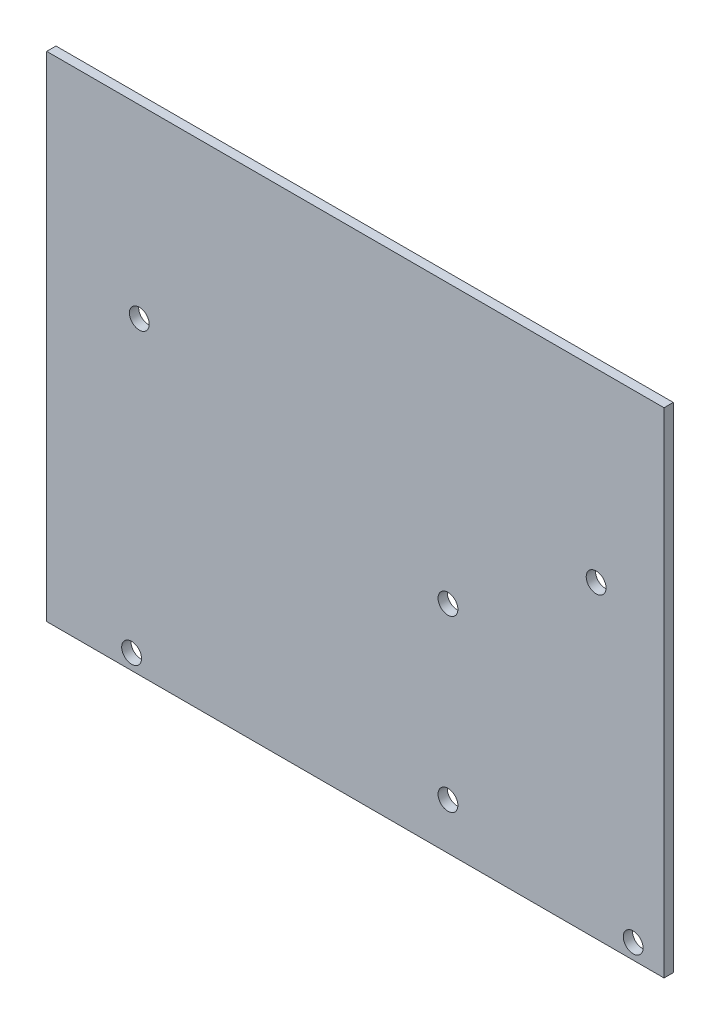
ISO-10303-21;
HEADER;
FILE_DESCRIPTION(('STEP AP214'),'2;1');
FILE_NAME('part.step','',(''),(''),'','','');
FILE_SCHEMA(('AUTOMOTIVE_DESIGN { 1 0 10303 214 1 1 1 1 }'));
ENDSEC;
DATA;
#1=APPLICATION_CONTEXT('core data for automotive mechanical design processes');
#2=APPLICATION_PROTOCOL_DEFINITION('international standard','automotive_design',2000,#1);
#3=PRODUCT_CONTEXT('',#1,'mechanical');
#4=PRODUCT('Part','Part','',(#3));
#5=PRODUCT_RELATED_PRODUCT_CATEGORY('part','',(#4));
#6=PRODUCT_DEFINITION_FORMATION('','',#4);
#7=PRODUCT_DEFINITION_CONTEXT('part definition',#1,'design');
#8=PRODUCT_DEFINITION('design','',#6,#7);
#9=PRODUCT_DEFINITION_SHAPE('','',#8);
#10=(LENGTH_UNIT() NAMED_UNIT(*) SI_UNIT(.MILLI.,.METRE.));
#11=(NAMED_UNIT(*) PLANE_ANGLE_UNIT() SI_UNIT($,.RADIAN.));
#12=(NAMED_UNIT(*) SI_UNIT($,.STERADIAN.) SOLID_ANGLE_UNIT());
#13=UNCERTAINTY_MEASURE_WITH_UNIT(LENGTH_MEASURE(1.E-05),#10,'distance_accuracy_value','');
#14=(GEOMETRIC_REPRESENTATION_CONTEXT(3) GLOBAL_UNCERTAINTY_ASSIGNED_CONTEXT((#13)) GLOBAL_UNIT_ASSIGNED_CONTEXT((#10,
#11,#12)) REPRESENTATION_CONTEXT('',''));
#15=CARTESIAN_POINT('',(0.,0.,0.));
#16=DIRECTION('',(0.,0.,1.));
#17=DIRECTION('',(1.,0.,0.));
#18=AXIS2_PLACEMENT_3D('',#15,#16,#17);
#19=CARTESIAN_POINT('',(50.8,-40.64,0.762));
#20=DIRECTION('',(-1.,0.,0.));
#21=DIRECTION('',(0.,0.,1.));
#22=AXIS2_PLACEMENT_3D('',#19,#20,#21);
#23=PLANE('',#22);
#24=DIRECTION('',(0.,1.,0.));
#25=VECTOR('',#24,1.);
#26=CARTESIAN_POINT('',(50.8,-40.64,-0.762));
#27=LINE('',#26,#25);
#28=CARTESIAN_POINT('',(50.8,-40.64,-0.762));
#29=VERTEX_POINT('',#28);
#30=CARTESIAN_POINT('',(50.8,40.64,-0.762));
#31=VERTEX_POINT('',#30);
#32=EDGE_CURVE('E95',#29,#31,#27,.T.);
#33=ORIENTED_EDGE('',*,*,#32,.T.);
#34=DIRECTION('',(0.,0.,-1.));
#35=VECTOR('',#34,1.);
#36=CARTESIAN_POINT('',(50.8,40.64,0.762));
#37=LINE('',#36,#35);
#38=CARTESIAN_POINT('',(50.8,40.64,0.762));
#39=VERTEX_POINT('',#38);
#40=EDGE_CURVE('E11',#39,#31,#37,.T.);
#41=ORIENTED_EDGE('',*,*,#40,.F.);
#42=DIRECTION('',(0.,1.,0.));
#43=VECTOR('',#42,1.);
#44=CARTESIAN_POINT('',(50.8,-40.64,0.762));
#45=LINE('',#44,#43);
#46=CARTESIAN_POINT('',(50.8,-40.64,0.762));
#47=VERTEX_POINT('',#46);
#48=EDGE_CURVE('E83',#47,#39,#45,.T.);
#49=ORIENTED_EDGE('',*,*,#48,.F.);
#50=DIRECTION('',(0.,0.,-1.));
#51=VECTOR('',#50,1.);
#52=CARTESIAN_POINT('',(50.8,-40.64,0.762));
#53=LINE('',#52,#51);
#54=EDGE_CURVE('E91',#47,#29,#53,.T.);
#55=ORIENTED_EDGE('',*,*,#54,.T.);
#56=EDGE_LOOP('',(#33,#41,#49,#55));
#57=FACE_BOUND('',#56,.T.);
#58=ADVANCED_FACE('F32',(#57),#23,.F.);
#59=CARTESIAN_POINT('',(-50.8,40.64,0.762));
#60=DIRECTION('',(0.,-1.,0.));
#61=DIRECTION('',(0.,0.,-1.));
#62=AXIS2_PLACEMENT_3D('',#59,#60,#61);
#63=PLANE('',#62);
#64=DIRECTION('',(-1.,0.,0.));
#65=VECTOR('',#64,1.);
#66=CARTESIAN_POINT('',(-50.8,40.64,-0.762));
#67=LINE('',#66,#65);
#68=CARTESIAN_POINT('',(-50.8,40.64,-0.762));
#69=VERTEX_POINT('',#68);
#70=EDGE_CURVE('E87',#31,#69,#67,.T.);
#71=ORIENTED_EDGE('',*,*,#70,.T.);
#72=DIRECTION('',(0.,0.,-1.));
#73=VECTOR('',#72,1.);
#74=CARTESIAN_POINT('',(-50.8,40.64,0.762));
#75=LINE('',#74,#73);
#76=CARTESIAN_POINT('',(-50.8,40.64,0.762));
#77=VERTEX_POINT('',#76);
#78=EDGE_CURVE('E40',#77,#69,#75,.T.);
#79=ORIENTED_EDGE('',*,*,#78,.F.);
#80=DIRECTION('',(-1.,0.,0.));
#81=VECTOR('',#80,1.);
#82=CARTESIAN_POINT('',(-50.8,40.64,0.762));
#83=LINE('',#82,#81);
#84=EDGE_CURVE('E78',#39,#77,#83,.T.);
#85=ORIENTED_EDGE('',*,*,#84,.F.);
#86=ORIENTED_EDGE('',*,*,#40,.T.);
#87=EDGE_LOOP('',(#71,#79,#85,#86));
#88=FACE_BOUND('',#87,.T.);
#89=ADVANCED_FACE('F86',(#88),#63,.F.);
#90=CARTESIAN_POINT('',(-50.8,-40.64,0.762));
#91=DIRECTION('',(1.,0.,0.));
#92=DIRECTION('',(0.,0.,-1.));
#93=AXIS2_PLACEMENT_3D('',#90,#91,#92);
#94=PLANE('',#93);
#95=DIRECTION('',(0.,-1.,0.));
#96=VECTOR('',#95,1.);
#97=CARTESIAN_POINT('',(-50.8,-40.64,-0.762));
#98=LINE('',#97,#96);
#99=CARTESIAN_POINT('',(-50.8,-40.64,-0.762));
#100=VERTEX_POINT('',#99);
#101=EDGE_CURVE('E65',#69,#100,#98,.T.);
#102=ORIENTED_EDGE('',*,*,#101,.T.);
#103=DIRECTION('',(0.,0.,-1.));
#104=VECTOR('',#103,1.);
#105=CARTESIAN_POINT('',(-50.8,-40.64,0.762));
#106=LINE('',#105,#104);
#107=CARTESIAN_POINT('',(-50.8,-40.64,0.762));
#108=VERTEX_POINT('',#107);
#109=EDGE_CURVE('E88',#108,#100,#106,.T.);
#110=ORIENTED_EDGE('',*,*,#109,.F.);
#111=DIRECTION('',(0.,-1.,0.));
#112=VECTOR('',#111,1.);
#113=CARTESIAN_POINT('',(-50.8,-40.64,0.762));
#114=LINE('',#113,#112);
#115=EDGE_CURVE('E81',#77,#108,#114,.T.);
#116=ORIENTED_EDGE('',*,*,#115,.F.);
#117=ORIENTED_EDGE('',*,*,#78,.T.);
#118=EDGE_LOOP('',(#102,#110,#116,#117));
#119=FACE_BOUND('',#118,.T.);
#120=ADVANCED_FACE('F89',(#119),#94,.F.);
#121=CARTESIAN_POINT('',(-50.8,-40.64,0.762));
#122=DIRECTION('',(0.,1.,0.));
#123=DIRECTION('',(0.,0.,1.));
#124=AXIS2_PLACEMENT_3D('',#121,#122,#123);
#125=PLANE('',#124);
#126=DIRECTION('',(1.,0.,0.));
#127=VECTOR('',#126,1.);
#128=CARTESIAN_POINT('',(-50.8,-40.64,-0.762));
#129=LINE('',#128,#127);
#130=EDGE_CURVE('E71',#100,#29,#129,.T.);
#131=ORIENTED_EDGE('',*,*,#130,.T.);
#132=ORIENTED_EDGE('',*,*,#54,.F.);
#133=DIRECTION('',(1.,0.,0.));
#134=VECTOR('',#133,1.);
#135=CARTESIAN_POINT('',(-50.8,-40.64,0.762));
#136=LINE('',#135,#134);
#137=EDGE_CURVE('E48',#108,#47,#136,.T.);
#138=ORIENTED_EDGE('',*,*,#137,.F.);
#139=ORIENTED_EDGE('',*,*,#109,.T.);
#140=EDGE_LOOP('',(#131,#132,#138,#139));
#141=FACE_BOUND('',#140,.T.);
#142=ADVANCED_FACE('F103',(#141),#125,.F.);
#143=CARTESIAN_POINT('',(0.,0.,0.762));
#144=DIRECTION('',(0.,0.,-1.));
#145=DIRECTION('',(-1.,0.,0.));
#146=AXIS2_PLACEMENT_3D('',#143,#144,#145);
#147=PLANE('',#146);
#148=CARTESIAN_POINT('',(-36.83,-38.1,0.762000000000001));
#149=DIRECTION('',(0.,0.,1.));
#150=DIRECTION('',(1.,0.,0.));
#151=AXIS2_PLACEMENT_3D('',#148,#149,#150);
#152=CIRCLE('',#151,1.63194999999999);
#153=CARTESIAN_POINT('',(-35.19805,-38.1,0.762000000000001));
#154=VERTEX_POINT('',#153);
#155=EDGE_CURVE('E141',#154,#154,#152,.T.);
#156=ORIENTED_EDGE('',*,*,#155,.F.);
#157=EDGE_LOOP('',(#156));
#158=FACE_BOUND('',#157,.T.);
#159=CARTESIAN_POINT('',(15.24,-33.02,0.762000000000001));
#160=DIRECTION('',(0.,0.,1.));
#161=DIRECTION('',(1.,0.,0.));
#162=AXIS2_PLACEMENT_3D('',#159,#160,#161);
#163=CIRCLE('',#162,1.63194999999999);
#164=CARTESIAN_POINT('',(16.87195,-33.02,0.762000000000001));
#165=VERTEX_POINT('',#164);
#166=EDGE_CURVE('E135',#165,#165,#163,.T.);
#167=ORIENTED_EDGE('',*,*,#166,.F.);
#168=EDGE_LOOP('',(#167));
#169=FACE_BOUND('',#168,.T.);
#170=CARTESIAN_POINT('',(15.24,-5.08,0.762000000000001));
#171=DIRECTION('',(0.,0.,1.));
#172=DIRECTION('',(1.,0.,0.));
#173=AXIS2_PLACEMENT_3D('',#170,#171,#172);
#174=CIRCLE('',#173,1.63194999999999);
#175=CARTESIAN_POINT('',(16.87195,-5.08,0.762000000000001));
#176=VERTEX_POINT('',#175);
#177=EDGE_CURVE('E129',#176,#176,#174,.T.);
#178=ORIENTED_EDGE('',*,*,#177,.F.);
#179=EDGE_LOOP('',(#178));
#180=FACE_BOUND('',#179,.T.);
#181=CARTESIAN_POINT('',(45.72,-38.1,0.762000000000001));
#182=DIRECTION('',(0.,0.,1.));
#183=DIRECTION('',(1.,0.,0.));
#184=AXIS2_PLACEMENT_3D('',#181,#182,#183);
#185=CIRCLE('',#184,1.63194999999999);
#186=CARTESIAN_POINT('',(47.35195,-38.1,0.762000000000001));
#187=VERTEX_POINT('',#186);
#188=EDGE_CURVE('E123',#187,#187,#185,.T.);
#189=ORIENTED_EDGE('',*,*,#188,.F.);
#190=EDGE_LOOP('',(#189));
#191=FACE_BOUND('',#190,.T.);
#192=CARTESIAN_POINT('',(-35.56,10.16,0.762000000000001));
#193=DIRECTION('',(0.,0.,1.));
#194=DIRECTION('',(1.,0.,0.));
#195=AXIS2_PLACEMENT_3D('',#192,#193,#194);
#196=CIRCLE('',#195,1.63194999999999);
#197=CARTESIAN_POINT('',(-33.92805,10.16,0.762000000000001));
#198=VERTEX_POINT('',#197);
#199=EDGE_CURVE('E117',#198,#198,#196,.T.);
#200=ORIENTED_EDGE('',*,*,#199,.F.);
#201=EDGE_LOOP('',(#200));
#202=FACE_BOUND('',#201,.T.);
#203=CARTESIAN_POINT('',(39.624,10.16,0.762000000000001));
#204=DIRECTION('',(0.,0.,1.));
#205=DIRECTION('',(1.,0.,0.));
#206=AXIS2_PLACEMENT_3D('',#203,#204,#205);
#207=CIRCLE('',#206,1.63194999999999);
#208=CARTESIAN_POINT('',(41.25595,10.16,0.762000000000001));
#209=VERTEX_POINT('',#208);
#210=EDGE_CURVE('E111',#209,#209,#207,.T.);
#211=ORIENTED_EDGE('',*,*,#210,.F.);
#212=EDGE_LOOP('',(#211));
#213=FACE_BOUND('',#212,.T.);
#214=ORIENTED_EDGE('',*,*,#48,.T.);
#215=ORIENTED_EDGE('',*,*,#84,.T.);
#216=ORIENTED_EDGE('',*,*,#115,.T.);
#217=ORIENTED_EDGE('',*,*,#137,.T.);
#218=EDGE_LOOP('',(#214,#215,#216,#217));
#219=FACE_BOUND('',#218,.T.);
#220=ADVANCED_FACE('F79',(#158,#169,#180,#191,#202,#213,#219),#147,.F.);
#221=CARTESIAN_POINT('',(0.,0.,-0.762));
#222=DIRECTION('',(0.,0.,-1.));
#223=DIRECTION('',(-1.,0.,0.));
#224=AXIS2_PLACEMENT_3D('',#221,#222,#223);
#225=PLANE('',#224);
#226=CARTESIAN_POINT('',(-36.83,-38.1,-0.762));
#227=DIRECTION('',(0.,0.,1.));
#228=DIRECTION('',(1.,0.,0.));
#229=AXIS2_PLACEMENT_3D('',#226,#227,#228);
#230=CIRCLE('',#229,1.63195);
#231=CARTESIAN_POINT('',(-35.19805,-38.1,-0.762));
#232=VERTEX_POINT('',#231);
#233=EDGE_CURVE('E138',#232,#232,#230,.T.);
#234=ORIENTED_EDGE('',*,*,#233,.T.);
#235=EDGE_LOOP('',(#234));
#236=FACE_BOUND('',#235,.T.);
#237=CARTESIAN_POINT('',(15.24,-33.02,-0.762));
#238=DIRECTION('',(0.,0.,1.));
#239=DIRECTION('',(1.,0.,0.));
#240=AXIS2_PLACEMENT_3D('',#237,#238,#239);
#241=CIRCLE('',#240,1.63195);
#242=CARTESIAN_POINT('',(16.87195,-33.02,-0.762));
#243=VERTEX_POINT('',#242);
#244=EDGE_CURVE('E132',#243,#243,#241,.T.);
#245=ORIENTED_EDGE('',*,*,#244,.T.);
#246=EDGE_LOOP('',(#245));
#247=FACE_BOUND('',#246,.T.);
#248=CARTESIAN_POINT('',(15.24,-5.08,-0.762));
#249=DIRECTION('',(0.,0.,1.));
#250=DIRECTION('',(1.,0.,0.));
#251=AXIS2_PLACEMENT_3D('',#248,#249,#250);
#252=CIRCLE('',#251,1.63195);
#253=CARTESIAN_POINT('',(16.87195,-5.08,-0.762));
#254=VERTEX_POINT('',#253);
#255=EDGE_CURVE('E126',#254,#254,#252,.T.);
#256=ORIENTED_EDGE('',*,*,#255,.T.);
#257=EDGE_LOOP('',(#256));
#258=FACE_BOUND('',#257,.T.);
#259=CARTESIAN_POINT('',(45.72,-38.1,-0.762));
#260=DIRECTION('',(0.,0.,1.));
#261=DIRECTION('',(1.,0.,0.));
#262=AXIS2_PLACEMENT_3D('',#259,#260,#261);
#263=CIRCLE('',#262,1.63195);
#264=CARTESIAN_POINT('',(47.35195,-38.1,-0.762));
#265=VERTEX_POINT('',#264);
#266=EDGE_CURVE('E120',#265,#265,#263,.T.);
#267=ORIENTED_EDGE('',*,*,#266,.T.);
#268=EDGE_LOOP('',(#267));
#269=FACE_BOUND('',#268,.T.);
#270=CARTESIAN_POINT('',(-35.56,10.16,-0.762));
#271=DIRECTION('',(0.,0.,1.));
#272=DIRECTION('',(1.,0.,0.));
#273=AXIS2_PLACEMENT_3D('',#270,#271,#272);
#274=CIRCLE('',#273,1.63195);
#275=CARTESIAN_POINT('',(-33.92805,10.16,-0.762));
#276=VERTEX_POINT('',#275);
#277=EDGE_CURVE('E114',#276,#276,#274,.T.);
#278=ORIENTED_EDGE('',*,*,#277,.T.);
#279=EDGE_LOOP('',(#278));
#280=FACE_BOUND('',#279,.T.);
#281=CARTESIAN_POINT('',(39.624,10.16,-0.762));
#282=DIRECTION('',(0.,0.,1.));
#283=DIRECTION('',(1.,0.,0.));
#284=AXIS2_PLACEMENT_3D('',#281,#282,#283);
#285=CIRCLE('',#284,1.63195);
#286=CARTESIAN_POINT('',(41.25595,10.16,-0.762));
#287=VERTEX_POINT('',#286);
#288=EDGE_CURVE('E98',#287,#287,#285,.T.);
#289=ORIENTED_EDGE('',*,*,#288,.T.);
#290=EDGE_LOOP('',(#289));
#291=FACE_BOUND('',#290,.T.);
#292=ORIENTED_EDGE('',*,*,#32,.F.);
#293=ORIENTED_EDGE('',*,*,#130,.F.);
#294=ORIENTED_EDGE('',*,*,#101,.F.);
#295=ORIENTED_EDGE('',*,*,#70,.F.);
#296=EDGE_LOOP('',(#292,#293,#294,#295));
#297=FACE_BOUND('',#296,.T.);
#298=ADVANCED_FACE('F106',(#236,#247,#258,#269,#280,#291,#297),#225,.T.);
#299=CARTESIAN_POINT('',(39.624,10.16,0.762));
#300=DIRECTION('',(0.,0.,1.));
#301=DIRECTION('',(1.,0.,0.));
#302=AXIS2_PLACEMENT_3D('',#299,#300,#301);
#303=CYLINDRICAL_SURFACE('',#302,1.63194999999999);
#304=ORIENTED_EDGE('',*,*,#288,.F.);
#305=EDGE_LOOP('',(#304));
#306=FACE_BOUND('',#305,.T.);
#307=ORIENTED_EDGE('',*,*,#210,.T.);
#308=EDGE_LOOP('',(#307));
#309=FACE_BOUND('',#308,.T.);
#310=ADVANCED_FACE('F160',(#306,#309),#303,.F.);
#311=CARTESIAN_POINT('',(-35.56,10.16,0.762));
#312=DIRECTION('',(0.,0.,1.));
#313=DIRECTION('',(1.,0.,0.));
#314=AXIS2_PLACEMENT_3D('',#311,#312,#313);
#315=CYLINDRICAL_SURFACE('',#314,1.63194999999999);
#316=ORIENTED_EDGE('',*,*,#277,.F.);
#317=EDGE_LOOP('',(#316));
#318=FACE_BOUND('',#317,.T.);
#319=ORIENTED_EDGE('',*,*,#199,.T.);
#320=EDGE_LOOP('',(#319));
#321=FACE_BOUND('',#320,.T.);
#322=ADVANCED_FACE('F162',(#318,#321),#315,.F.);
#323=CARTESIAN_POINT('',(45.72,-38.1,0.762));
#324=DIRECTION('',(0.,0.,1.));
#325=DIRECTION('',(1.,0.,0.));
#326=AXIS2_PLACEMENT_3D('',#323,#324,#325);
#327=CYLINDRICAL_SURFACE('',#326,1.63194999999999);
#328=ORIENTED_EDGE('',*,*,#266,.F.);
#329=EDGE_LOOP('',(#328));
#330=FACE_BOUND('',#329,.T.);
#331=ORIENTED_EDGE('',*,*,#188,.T.);
#332=EDGE_LOOP('',(#331));
#333=FACE_BOUND('',#332,.T.);
#334=ADVANCED_FACE('F169',(#330,#333),#327,.F.);
#335=CARTESIAN_POINT('',(15.24,-5.08,0.762));
#336=DIRECTION('',(0.,0.,1.));
#337=DIRECTION('',(1.,0.,0.));
#338=AXIS2_PLACEMENT_3D('',#335,#336,#337);
#339=CYLINDRICAL_SURFACE('',#338,1.63194999999999);
#340=ORIENTED_EDGE('',*,*,#255,.F.);
#341=EDGE_LOOP('',(#340));
#342=FACE_BOUND('',#341,.T.);
#343=ORIENTED_EDGE('',*,*,#177,.T.);
#344=EDGE_LOOP('',(#343));
#345=FACE_BOUND('',#344,.T.);
#346=ADVANCED_FACE('F216',(#342,#345),#339,.F.);
#347=CARTESIAN_POINT('',(15.24,-33.02,0.762));
#348=DIRECTION('',(0.,0.,1.));
#349=DIRECTION('',(1.,0.,0.));
#350=AXIS2_PLACEMENT_3D('',#347,#348,#349);
#351=CYLINDRICAL_SURFACE('',#350,1.63194999999999);
#352=ORIENTED_EDGE('',*,*,#244,.F.);
#353=EDGE_LOOP('',(#352));
#354=FACE_BOUND('',#353,.T.);
#355=ORIENTED_EDGE('',*,*,#166,.T.);
#356=EDGE_LOOP('',(#355));
#357=FACE_BOUND('',#356,.T.);
#358=ADVANCED_FACE('F226',(#354,#357),#351,.F.);
#359=CARTESIAN_POINT('',(-36.83,-38.1,0.762));
#360=DIRECTION('',(0.,0.,1.));
#361=DIRECTION('',(1.,0.,0.));
#362=AXIS2_PLACEMENT_3D('',#359,#360,#361);
#363=CYLINDRICAL_SURFACE('',#362,1.63194999999999);
#364=ORIENTED_EDGE('',*,*,#233,.F.);
#365=EDGE_LOOP('',(#364));
#366=FACE_BOUND('',#365,.T.);
#367=ORIENTED_EDGE('',*,*,#155,.T.);
#368=EDGE_LOOP('',(#367));
#369=FACE_BOUND('',#368,.T.);
#370=ADVANCED_FACE('F145',(#366,#369),#363,.F.);
#371=CLOSED_SHELL('',(#58,#89,#120,#142,#220,#298,#310,#322,#334,#346,#358,#370));
#372=MANIFOLD_SOLID_BREP('B2',#371);
#373=ADVANCED_BREP_SHAPE_REPRESENTATION('',(#18,#372),#14);
#374=SHAPE_DEFINITION_REPRESENTATION(#9,#373);
ENDSEC;
END-ISO-10303-21;
